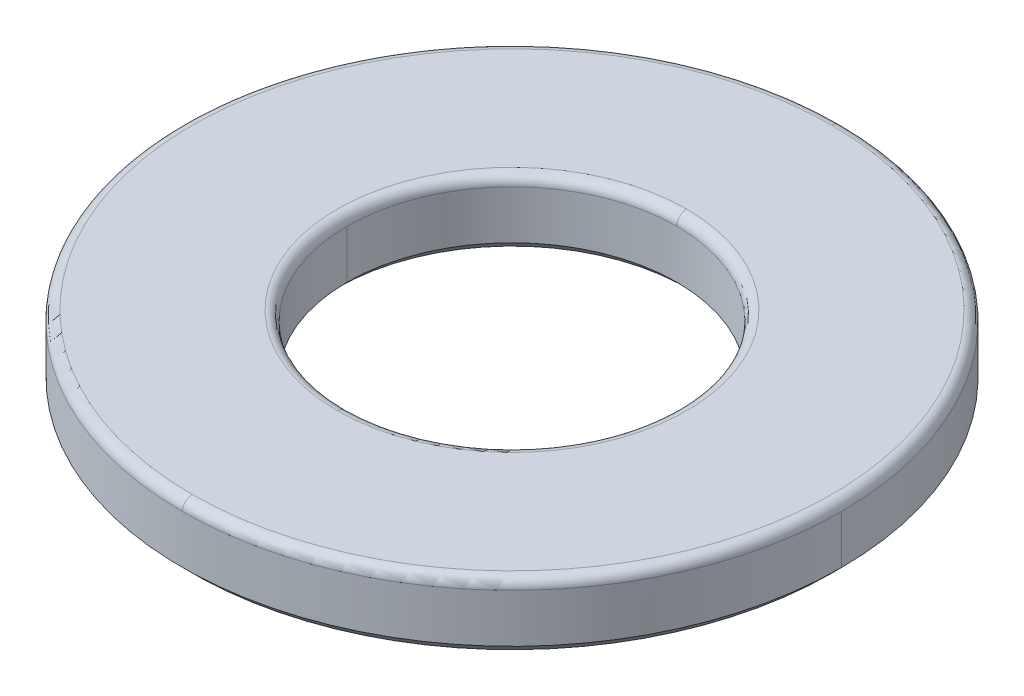
ISO-10303-21;
HEADER;
FILE_DESCRIPTION(('STEP AP214'),'2;1');
FILE_NAME('part.step','',(''),(''),'','','');
FILE_SCHEMA(('AUTOMOTIVE_DESIGN { 1 0 10303 214 1 1 1 1 }'));
ENDSEC;
DATA;
#1=APPLICATION_CONTEXT('core data for automotive mechanical design processes');
#2=APPLICATION_PROTOCOL_DEFINITION('international standard','automotive_design',2000,#1);
#3=PRODUCT_CONTEXT('',#1,'mechanical');
#4=PRODUCT('Part','Part','',(#3));
#5=PRODUCT_RELATED_PRODUCT_CATEGORY('part','',(#4));
#6=PRODUCT_DEFINITION_FORMATION('','',#4);
#7=PRODUCT_DEFINITION_CONTEXT('part definition',#1,'design');
#8=PRODUCT_DEFINITION('design','',#6,#7);
#9=PRODUCT_DEFINITION_SHAPE('','',#8);
#10=(LENGTH_UNIT() NAMED_UNIT(*) SI_UNIT(.MILLI.,.METRE.));
#11=(NAMED_UNIT(*) PLANE_ANGLE_UNIT() SI_UNIT($,.RADIAN.));
#12=(NAMED_UNIT(*) SI_UNIT($,.STERADIAN.) SOLID_ANGLE_UNIT());
#13=UNCERTAINTY_MEASURE_WITH_UNIT(LENGTH_MEASURE(1.E-05),#10,'distance_accuracy_value','');
#14=(GEOMETRIC_REPRESENTATION_CONTEXT(3) GLOBAL_UNCERTAINTY_ASSIGNED_CONTEXT((#13)) GLOBAL_UNIT_ASSIGNED_CONTEXT((#10,
#11,#12)) REPRESENTATION_CONTEXT('',''));
#15=CARTESIAN_POINT('',(0.,0.,0.));
#16=DIRECTION('',(0.,0.,1.));
#17=DIRECTION('',(1.,0.,0.));
#18=AXIS2_PLACEMENT_3D('',#15,#16,#17);
#19=CARTESIAN_POINT('',(0.,13.4,0.));
#20=DIRECTION('',(0.,-1.,0.));
#21=DIRECTION('',(0.,0.,-1.));
#22=AXIS2_PLACEMENT_3D('',#19,#20,#21);
#23=TOROIDAL_SURFACE('',#22,19.4,0.6);
#24=CARTESIAN_POINT('',(0.,13.4,19.4));
#25=DIRECTION('',(1.,0.,0.));
#26=DIRECTION('',(0.,0.,-1.));
#27=AXIS2_PLACEMENT_3D('',#24,#25,#26);
#28=CIRCLE('',#27,0.6);
#29=CARTESIAN_POINT('',(0.,14.,19.4));
#30=VERTEX_POINT('',#29);
#31=CARTESIAN_POINT('',(0.,13.4,20.));
#32=VERTEX_POINT('',#31);
#33=EDGE_CURVE('E151',#30,#32,#28,.T.);
#34=ORIENTED_EDGE('',*,*,#33,.F.);
#35=CARTESIAN_POINT('',(0.,14.,0.));
#36=DIRECTION('',(0.,-1.,0.));
#37=DIRECTION('',(1.,0.,0.));
#38=AXIS2_PLACEMENT_3D('',#35,#36,#37);
#39=CIRCLE('',#38,19.4);
#40=CARTESIAN_POINT('',(0.,14.,-19.4));
#41=VERTEX_POINT('',#40);
#42=EDGE_CURVE('E153',#30,#41,#39,.T.);
#43=ORIENTED_EDGE('',*,*,#42,.T.);
#44=CARTESIAN_POINT('',(0.,13.4,-19.4));
#45=DIRECTION('',(-1.,0.,0.));
#46=DIRECTION('',(0.,0.,1.));
#47=AXIS2_PLACEMENT_3D('',#44,#45,#46);
#48=CIRCLE('',#47,0.6);
#49=CARTESIAN_POINT('',(0.,13.4,-20.));
#50=VERTEX_POINT('',#49);
#51=EDGE_CURVE('E162',#41,#50,#48,.T.);
#52=ORIENTED_EDGE('',*,*,#51,.T.);
#53=CARTESIAN_POINT('',(0.,13.4,0.));
#54=DIRECTION('',(0.,-1.,0.));
#55=DIRECTION('',(1.,0.,0.));
#56=AXIS2_PLACEMENT_3D('',#53,#54,#55);
#57=CIRCLE('',#56,20.);
#58=CARTESIAN_POINT('',(-20.,13.4,0.));
#59=VERTEX_POINT('',#58);
#60=EDGE_CURVE('E185',#59,#50,#57,.T.);
#61=ORIENTED_EDGE('',*,*,#60,.F.);
#62=CARTESIAN_POINT('',(0.,13.4,0.));
#63=DIRECTION('',(0.,-1.,0.));
#64=DIRECTION('',(1.,0.,0.));
#65=AXIS2_PLACEMENT_3D('',#62,#63,#64);
#66=CIRCLE('',#65,20.);
#67=EDGE_CURVE('E11',#32,#59,#66,.T.);
#68=ORIENTED_EDGE('',*,*,#67,.F.);
#69=EDGE_LOOP('',(#34,#43,#52,#61,#68));
#70=FACE_BOUND('',#69,.T.);
#71=ADVANCED_FACE('F17',(#70),#23,.T.);
#72=CARTESIAN_POINT('',(0.,11.9288,0.));
#73=DIRECTION('',(0.,1.,0.));
#74=DIRECTION('',(1.,0.,0.));
#75=AXIS2_PLACEMENT_3D('',#72,#73,#74);
#76=CYLINDRICAL_SURFACE('',#75,20.);
#77=DIRECTION('',(0.,1.,0.));
#78=VECTOR('',#77,1.);
#79=CARTESIAN_POINT('',(-20.,11.9288,0.));
#80=LINE('',#79,#78);
#81=CARTESIAN_POINT('',(-20.,10.4576,0.));
#82=VERTEX_POINT('',#81);
#83=EDGE_CURVE('E161',#82,#59,#80,.T.);
#84=ORIENTED_EDGE('',*,*,#83,.F.);
#85=CARTESIAN_POINT('',(0.,10.4576,0.));
#86=DIRECTION('',(0.,-1.,0.));
#87=DIRECTION('',(1.,0.,0.));
#88=AXIS2_PLACEMENT_3D('',#85,#86,#87);
#89=CIRCLE('',#88,20.);
#90=CARTESIAN_POINT('',(20.,10.4576,0.));
#91=VERTEX_POINT('',#90);
#92=EDGE_CURVE('E28',#91,#82,#89,.T.);
#93=ORIENTED_EDGE('',*,*,#92,.F.);
#94=DIRECTION('',(0.,1.,0.));
#95=VECTOR('',#94,1.);
#96=CARTESIAN_POINT('',(20.,11.9288,0.));
#97=LINE('',#96,#95);
#98=CARTESIAN_POINT('',(20.,13.4,0.));
#99=VERTEX_POINT('',#98);
#100=EDGE_CURVE('E187',#91,#99,#97,.T.);
#101=ORIENTED_EDGE('',*,*,#100,.T.);
#102=CARTESIAN_POINT('',(0.,13.4,0.));
#103=DIRECTION('',(0.,-1.,0.));
#104=DIRECTION('',(1.,0.,0.));
#105=AXIS2_PLACEMENT_3D('',#102,#103,#104);
#106=CIRCLE('',#105,20.);
#107=EDGE_CURVE('E172',#99,#32,#106,.T.);
#108=ORIENTED_EDGE('',*,*,#107,.T.);
#109=ORIENTED_EDGE('',*,*,#67,.T.);
#110=EDGE_LOOP('',(#84,#93,#101,#108,#109));
#111=FACE_BOUND('',#110,.T.);
#112=ADVANCED_FACE('F478',(#111),#76,.T.);
#113=CARTESIAN_POINT('',(0.,10.1576,0.));
#114=DIRECTION('',(0.,1.,0.));
#115=DIRECTION('',(1.,0.,0.));
#116=AXIS2_PLACEMENT_3D('',#113,#114,#115);
#117=CONICAL_SURFACE('',#116,19.7,0.785398163397446);
#118=DIRECTION('',(-0.707106781186546,0.707106781186549,0.));
#119=VECTOR('',#118,1.);
#120=CARTESIAN_POINT('',(-19.7,10.1576,0.));
#121=LINE('',#120,#119);
#122=CARTESIAN_POINT('',(-19.4,9.8576,0.));
#123=VERTEX_POINT('',#122);
#124=EDGE_CURVE('E193',#123,#82,#121,.T.);
#125=ORIENTED_EDGE('',*,*,#124,.F.);
#126=CARTESIAN_POINT('',(0.,9.8576,0.));
#127=DIRECTION('',(0.,-1.,0.));
#128=DIRECTION('',(1.,0.,0.));
#129=AXIS2_PLACEMENT_3D('',#126,#127,#128);
#130=CIRCLE('',#129,19.4);
#131=CARTESIAN_POINT('',(19.4,9.8576,0.));
#132=VERTEX_POINT('',#131);
#133=EDGE_CURVE('E129',#132,#123,#130,.T.);
#134=ORIENTED_EDGE('',*,*,#133,.F.);
#135=DIRECTION('',(0.707106781186546,0.707106781186549,0.));
#136=VECTOR('',#135,1.);
#137=CARTESIAN_POINT('',(19.7,10.1576,0.));
#138=LINE('',#137,#136);
#139=EDGE_CURVE('E147',#132,#91,#138,.T.);
#140=ORIENTED_EDGE('',*,*,#139,.T.);
#141=ORIENTED_EDGE('',*,*,#92,.T.);
#142=EDGE_LOOP('',(#125,#134,#140,#141));
#143=FACE_BOUND('',#142,.T.);
#144=ADVANCED_FACE('F474',(#143),#117,.T.);
#145=CARTESIAN_POINT('',(18.2716,9.8576,0.));
#146=DIRECTION('',(0.,-1.,0.));
#147=DIRECTION('',(-1.,0.,0.));
#148=AXIS2_PLACEMENT_3D('',#145,#146,#147);
#149=PLANE('',#148);
#150=CARTESIAN_POINT('',(0.,9.8576,0.));
#151=DIRECTION('',(0.,-1.,0.));
#152=DIRECTION('',(1.,0.,0.));
#153=AXIS2_PLACEMENT_3D('',#150,#151,#152);
#154=CIRCLE('',#153,17.1432);
#155=CARTESIAN_POINT('',(0.,9.8576,-17.1432));
#156=VERTEX_POINT('',#155);
#157=CARTESIAN_POINT('',(0.,9.8576,17.1432));
#158=VERTEX_POINT('',#157);
#159=EDGE_CURVE('E119',#156,#158,#154,.T.);
#160=ORIENTED_EDGE('',*,*,#159,.F.);
#161=CARTESIAN_POINT('',(0.,9.8576,0.));
#162=DIRECTION('',(0.,-1.,0.));
#163=DIRECTION('',(1.,0.,0.));
#164=AXIS2_PLACEMENT_3D('',#161,#162,#163);
#165=CIRCLE('',#164,17.1432);
#166=EDGE_CURVE('E132',#158,#156,#165,.T.);
#167=ORIENTED_EDGE('',*,*,#166,.F.);
#168=EDGE_LOOP('',(#160,#167));
#169=FACE_BOUND('',#168,.T.);
#170=ORIENTED_EDGE('',*,*,#133,.T.);
#171=CARTESIAN_POINT('',(0.,9.8576,0.));
#172=DIRECTION('',(0.,-1.,0.));
#173=DIRECTION('',(1.,0.,0.));
#174=AXIS2_PLACEMENT_3D('',#171,#172,#173);
#175=CIRCLE('',#174,19.4);
#176=EDGE_CURVE('E190',#123,#132,#175,.T.);
#177=ORIENTED_EDGE('',*,*,#176,.T.);
#178=EDGE_LOOP('',(#170,#177));
#179=FACE_BOUND('',#178,.T.);
#180=ADVANCED_FACE('F133',(#169,#179),#149,.T.);
#181=CARTESIAN_POINT('',(0.,7.,0.));
#182=DIRECTION('',(0.,-1.,0.));
#183=DIRECTION('',(0.,0.,-1.));
#184=AXIS2_PLACEMENT_3D('',#181,#182,#183);
#185=TOROIDAL_SURFACE('',#184,15.,3.572);
#186=CARTESIAN_POINT('',(0.,7.,15.));
#187=DIRECTION('',(1.,0.,0.));
#188=DIRECTION('',(0.,0.,-1.));
#189=AXIS2_PLACEMENT_3D('',#186,#187,#188);
#190=CIRCLE('',#189,3.572);
#191=CARTESIAN_POINT('',(0.,9.8576,12.8568));
#192=VERTEX_POINT('',#191);
#193=EDGE_CURVE('E122',#192,#158,#190,.T.);
#194=ORIENTED_EDGE('',*,*,#193,.F.);
#195=CARTESIAN_POINT('',(0.,9.8576,0.));
#196=DIRECTION('',(0.,-1.,0.));
#197=DIRECTION('',(1.,0.,0.));
#198=AXIS2_PLACEMENT_3D('',#195,#196,#197);
#199=CIRCLE('',#198,12.8568);
#200=CARTESIAN_POINT('',(0.,9.8576,-12.8568));
#201=VERTEX_POINT('',#200);
#202=EDGE_CURVE('E130',#201,#192,#199,.T.);
#203=ORIENTED_EDGE('',*,*,#202,.F.);
#204=CARTESIAN_POINT('',(0.,7.,-15.));
#205=DIRECTION('',(-1.,0.,0.));
#206=DIRECTION('',(0.,0.,1.));
#207=AXIS2_PLACEMENT_3D('',#204,#205,#206);
#208=CIRCLE('',#207,3.572);
#209=EDGE_CURVE('E125',#201,#156,#208,.T.);
#210=ORIENTED_EDGE('',*,*,#209,.T.);
#211=ORIENTED_EDGE('',*,*,#159,.T.);
#212=EDGE_LOOP('',(#194,#203,#210,#211));
#213=FACE_BOUND('',#212,.T.);
#214=ADVANCED_FACE('F19',(#213),#185,.F.);
#215=CARTESIAN_POINT('',(11.7284,9.8576,0.));
#216=DIRECTION('',(0.,-1.,0.));
#217=DIRECTION('',(-1.,0.,0.));
#218=AXIS2_PLACEMENT_3D('',#215,#216,#217);
#219=PLANE('',#218);
#220=CARTESIAN_POINT('',(0.,9.8576,0.));
#221=DIRECTION('',(0.,-1.,0.));
#222=DIRECTION('',(1.,0.,0.));
#223=AXIS2_PLACEMENT_3D('',#220,#221,#222);
#224=CIRCLE('',#223,10.6);
#225=CARTESIAN_POINT('',(10.6,9.8576,0.));
#226=VERTEX_POINT('',#225);
#227=CARTESIAN_POINT('',(-10.6,9.8576,0.));
#228=VERTEX_POINT('',#227);
#229=EDGE_CURVE('E229',#226,#228,#224,.T.);
#230=ORIENTED_EDGE('',*,*,#229,.F.);
#231=CARTESIAN_POINT('',(0.,9.8576,0.));
#232=DIRECTION('',(0.,-1.,0.));
#233=DIRECTION('',(1.,0.,0.));
#234=AXIS2_PLACEMENT_3D('',#231,#232,#233);
#235=CIRCLE('',#234,10.6);
#236=EDGE_CURVE('E171',#228,#226,#235,.T.);
#237=ORIENTED_EDGE('',*,*,#236,.F.);
#238=EDGE_LOOP('',(#230,#237));
#239=FACE_BOUND('',#238,.T.);
#240=ORIENTED_EDGE('',*,*,#202,.T.);
#241=CARTESIAN_POINT('',(0.,9.8576,0.));
#242=DIRECTION('',(0.,-1.,0.));
#243=DIRECTION('',(1.,0.,0.));
#244=AXIS2_PLACEMENT_3D('',#241,#242,#243);
#245=CIRCLE('',#244,12.8568);
#246=EDGE_CURVE('E140',#192,#201,#245,.T.);
#247=ORIENTED_EDGE('',*,*,#246,.T.);
#248=EDGE_LOOP('',(#240,#247));
#249=FACE_BOUND('',#248,.T.);
#250=ADVANCED_FACE('F532',(#239,#249),#219,.T.);
#251=CARTESIAN_POINT('',(0.,10.1576,0.));
#252=DIRECTION('',(0.,-1.,0.));
#253=DIRECTION('',(1.,0.,0.));
#254=AXIS2_PLACEMENT_3D('',#251,#252,#253);
#255=CONICAL_SURFACE('',#254,10.3,0.78539816339745);
#256=DIRECTION('',(-0.707106781186549,-0.707106781186546,0.));
#257=VECTOR('',#256,1.);
#258=CARTESIAN_POINT('',(-10.3,10.1576,0.));
#259=LINE('',#258,#257);
#260=CARTESIAN_POINT('',(-10.,10.4576,0.));
#261=VERTEX_POINT('',#260);
#262=EDGE_CURVE('E249',#261,#228,#259,.T.);
#263=ORIENTED_EDGE('',*,*,#262,.F.);
#264=CARTESIAN_POINT('',(0.,10.4576,0.));
#265=DIRECTION('',(0.,-1.,0.));
#266=DIRECTION('',(1.,0.,0.));
#267=AXIS2_PLACEMENT_3D('',#264,#265,#266);
#268=CIRCLE('',#267,10.);
#269=CARTESIAN_POINT('',(10.,10.4576,0.));
#270=VERTEX_POINT('',#269);
#271=EDGE_CURVE('E170',#270,#261,#268,.T.);
#272=ORIENTED_EDGE('',*,*,#271,.F.);
#273=DIRECTION('',(0.707106781186549,-0.707106781186546,0.));
#274=VECTOR('',#273,1.);
#275=CARTESIAN_POINT('',(10.3,10.1576,0.));
#276=LINE('',#275,#274);
#277=EDGE_CURVE('E166',#270,#226,#276,.T.);
#278=ORIENTED_EDGE('',*,*,#277,.T.);
#279=ORIENTED_EDGE('',*,*,#229,.T.);
#280=EDGE_LOOP('',(#263,#272,#278,#279));
#281=FACE_BOUND('',#280,.T.);
#282=ADVANCED_FACE('F536',(#281),#255,.F.);
#283=CARTESIAN_POINT('',(0.,11.9288,0.));
#284=DIRECTION('',(0.,1.,0.));
#285=DIRECTION('',(1.,0.,0.));
#286=AXIS2_PLACEMENT_3D('',#283,#284,#285);
#287=CYLINDRICAL_SURFACE('',#286,10.);
#288=DIRECTION('',(0.,1.,0.));
#289=VECTOR('',#288,1.);
#290=CARTESIAN_POINT('',(-10.,11.9288,0.));
#291=LINE('',#290,#289);
#292=CARTESIAN_POINT('',(-10.,13.4,0.));
#293=VERTEX_POINT('',#292);
#294=EDGE_CURVE('E217',#261,#293,#291,.T.);
#295=ORIENTED_EDGE('',*,*,#294,.F.);
#296=CARTESIAN_POINT('',(0.,10.4576,0.));
#297=DIRECTION('',(0.,-1.,0.));
#298=DIRECTION('',(1.,0.,0.));
#299=AXIS2_PLACEMENT_3D('',#296,#297,#298);
#300=CIRCLE('',#299,10.);
#301=EDGE_CURVE('E21',#261,#270,#300,.T.);
#302=ORIENTED_EDGE('',*,*,#301,.T.);
#303=DIRECTION('',(0.,1.,0.));
#304=VECTOR('',#303,1.);
#305=CARTESIAN_POINT('',(10.,11.9288,0.));
#306=LINE('',#305,#304);
#307=CARTESIAN_POINT('',(10.,13.4,0.));
#308=VERTEX_POINT('',#307);
#309=EDGE_CURVE('E181',#270,#308,#306,.T.);
#310=ORIENTED_EDGE('',*,*,#309,.T.);
#311=CARTESIAN_POINT('',(0.,13.4,0.));
#312=DIRECTION('',(0.,-1.,0.));
#313=DIRECTION('',(1.,0.,0.));
#314=AXIS2_PLACEMENT_3D('',#311,#312,#313);
#315=CIRCLE('',#314,10.);
#316=CARTESIAN_POINT('',(0.,13.4,-10.));
#317=VERTEX_POINT('',#316);
#318=EDGE_CURVE('E210',#317,#308,#315,.T.);
#319=ORIENTED_EDGE('',*,*,#318,.F.);
#320=CARTESIAN_POINT('',(0.,13.4,0.));
#321=DIRECTION('',(0.,-1.,0.));
#322=DIRECTION('',(1.,0.,0.));
#323=AXIS2_PLACEMENT_3D('',#320,#321,#322);
#324=CIRCLE('',#323,10.);
#325=EDGE_CURVE('E227',#293,#317,#324,.T.);
#326=ORIENTED_EDGE('',*,*,#325,.F.);
#327=EDGE_LOOP('',(#295,#302,#310,#319,#326));
#328=FACE_BOUND('',#327,.T.);
#329=ADVANCED_FACE('F275',(#328),#287,.F.);
#330=CARTESIAN_POINT('',(0.,13.4,0.));
#331=DIRECTION('',(0.,-1.,0.));
#332=DIRECTION('',(0.,0.,-1.));
#333=AXIS2_PLACEMENT_3D('',#330,#331,#332);
#334=TOROIDAL_SURFACE('',#333,10.6,0.6);
#335=CARTESIAN_POINT('',(0.,13.4,10.6));
#336=DIRECTION('',(1.,0.,0.));
#337=DIRECTION('',(0.,0.,-1.));
#338=AXIS2_PLACEMENT_3D('',#335,#336,#337);
#339=CIRCLE('',#338,0.6);
#340=CARTESIAN_POINT('',(0.,13.4,10.));
#341=VERTEX_POINT('',#340);
#342=CARTESIAN_POINT('',(0.,14.,10.6));
#343=VERTEX_POINT('',#342);
#344=EDGE_CURVE('E218',#341,#343,#339,.T.);
#345=ORIENTED_EDGE('',*,*,#344,.F.);
#346=CARTESIAN_POINT('',(0.,13.4,0.));
#347=DIRECTION('',(0.,-1.,0.));
#348=DIRECTION('',(1.,0.,0.));
#349=AXIS2_PLACEMENT_3D('',#346,#347,#348);
#350=CIRCLE('',#349,10.);
#351=EDGE_CURVE('E182',#341,#293,#350,.T.);
#352=ORIENTED_EDGE('',*,*,#351,.T.);
#353=ORIENTED_EDGE('',*,*,#325,.T.);
#354=CARTESIAN_POINT('',(0.,13.4,-10.6));
#355=DIRECTION('',(-1.,0.,0.));
#356=DIRECTION('',(0.,0.,1.));
#357=AXIS2_PLACEMENT_3D('',#354,#355,#356);
#358=CIRCLE('',#357,0.6);
#359=CARTESIAN_POINT('',(0.,14.,-10.6));
#360=VERTEX_POINT('',#359);
#361=EDGE_CURVE('E157',#317,#360,#358,.T.);
#362=ORIENTED_EDGE('',*,*,#361,.T.);
#363=CARTESIAN_POINT('',(0.,14.,0.));
#364=DIRECTION('',(0.,-1.,0.));
#365=DIRECTION('',(1.,0.,0.));
#366=AXIS2_PLACEMENT_3D('',#363,#364,#365);
#367=CIRCLE('',#366,10.6);
#368=EDGE_CURVE('E42',#343,#360,#367,.T.);
#369=ORIENTED_EDGE('',*,*,#368,.F.);
#370=EDGE_LOOP('',(#345,#352,#353,#362,#369));
#371=FACE_BOUND('',#370,.T.);
#372=ADVANCED_FACE('F267',(#371),#334,.T.);
#373=CARTESIAN_POINT('',(15.,14.,0.));
#374=DIRECTION('',(0.,1.,0.));
#375=DIRECTION('',(0.,0.,-1.));
#376=AXIS2_PLACEMENT_3D('',#373,#374,#375);
#377=PLANE('',#376);
#378=CARTESIAN_POINT('',(0.,14.,0.));
#379=DIRECTION('',(0.,-1.,0.));
#380=DIRECTION('',(1.,0.,0.));
#381=AXIS2_PLACEMENT_3D('',#378,#379,#380);
#382=CIRCLE('',#381,10.6);
#383=EDGE_CURVE('E222',#360,#343,#382,.T.);
#384=ORIENTED_EDGE('',*,*,#383,.T.);
#385=ORIENTED_EDGE('',*,*,#368,.T.);
#386=EDGE_LOOP('',(#384,#385));
#387=FACE_BOUND('',#386,.T.);
#388=CARTESIAN_POINT('',(0.,14.,0.));
#389=DIRECTION('',(0.,-1.,0.));
#390=DIRECTION('',(1.,0.,0.));
#391=AXIS2_PLACEMENT_3D('',#388,#389,#390);
#392=CIRCLE('',#391,19.4);
#393=EDGE_CURVE('E245',#41,#30,#392,.T.);
#394=ORIENTED_EDGE('',*,*,#393,.F.);
#395=ORIENTED_EDGE('',*,*,#42,.F.);
#396=EDGE_LOOP('',(#394,#395));
#397=FACE_BOUND('',#396,.T.);
#398=ADVANCED_FACE('F466',(#387,#397),#377,.T.);
#399=CARTESIAN_POINT('',(0.,13.4,0.));
#400=DIRECTION('',(0.,-1.,0.));
#401=DIRECTION('',(0.,0.,-1.));
#402=AXIS2_PLACEMENT_3D('',#399,#400,#401);
#403=TOROIDAL_SURFACE('',#402,10.6,0.6);
#404=ORIENTED_EDGE('',*,*,#318,.T.);
#405=CARTESIAN_POINT('',(0.,13.4,0.));
#406=DIRECTION('',(0.,-1.,0.));
#407=DIRECTION('',(1.,0.,0.));
#408=AXIS2_PLACEMENT_3D('',#405,#406,#407);
#409=CIRCLE('',#408,10.);
#410=EDGE_CURVE('E177',#308,#341,#409,.T.);
#411=ORIENTED_EDGE('',*,*,#410,.T.);
#412=ORIENTED_EDGE('',*,*,#344,.T.);
#413=ORIENTED_EDGE('',*,*,#383,.F.);
#414=ORIENTED_EDGE('',*,*,#361,.F.);
#415=EDGE_LOOP('',(#404,#411,#412,#413,#414));
#416=FACE_BOUND('',#415,.T.);
#417=ADVANCED_FACE('F274',(#416),#403,.T.);
#418=CARTESIAN_POINT('',(0.,11.9288,0.));
#419=DIRECTION('',(0.,1.,0.));
#420=DIRECTION('',(1.,0.,0.));
#421=AXIS2_PLACEMENT_3D('',#418,#419,#420);
#422=CYLINDRICAL_SURFACE('',#421,10.);
#423=ORIENTED_EDGE('',*,*,#271,.T.);
#424=ORIENTED_EDGE('',*,*,#294,.T.);
#425=ORIENTED_EDGE('',*,*,#351,.F.);
#426=ORIENTED_EDGE('',*,*,#410,.F.);
#427=ORIENTED_EDGE('',*,*,#309,.F.);
#428=EDGE_LOOP('',(#423,#424,#425,#426,#427));
#429=FACE_BOUND('',#428,.T.);
#430=ADVANCED_FACE('F456',(#429),#422,.F.);
#431=CARTESIAN_POINT('',(0.,10.1576,0.));
#432=DIRECTION('',(0.,-1.,0.));
#433=DIRECTION('',(1.,0.,0.));
#434=AXIS2_PLACEMENT_3D('',#431,#432,#433);
#435=CONICAL_SURFACE('',#434,10.3,0.78539816339745);
#436=ORIENTED_EDGE('',*,*,#301,.F.);
#437=ORIENTED_EDGE('',*,*,#262,.T.);
#438=ORIENTED_EDGE('',*,*,#236,.T.);
#439=ORIENTED_EDGE('',*,*,#277,.F.);
#440=EDGE_LOOP('',(#436,#437,#438,#439));
#441=FACE_BOUND('',#440,.T.);
#442=ADVANCED_FACE('F460',(#441),#435,.F.);
#443=CARTESIAN_POINT('',(0.,7.,0.));
#444=DIRECTION('',(0.,-1.,0.));
#445=DIRECTION('',(0.,0.,-1.));
#446=AXIS2_PLACEMENT_3D('',#443,#444,#445);
#447=TOROIDAL_SURFACE('',#446,15.,3.572);
#448=ORIENTED_EDGE('',*,*,#246,.F.);
#449=ORIENTED_EDGE('',*,*,#193,.T.);
#450=ORIENTED_EDGE('',*,*,#166,.T.);
#451=ORIENTED_EDGE('',*,*,#209,.F.);
#452=EDGE_LOOP('',(#448,#449,#450,#451));
#453=FACE_BOUND('',#452,.T.);
#454=ADVANCED_FACE('F138',(#453),#447,.F.);
#455=CARTESIAN_POINT('',(0.,10.1576,0.));
#456=DIRECTION('',(0.,1.,0.));
#457=DIRECTION('',(1.,0.,0.));
#458=AXIS2_PLACEMENT_3D('',#455,#456,#457);
#459=CONICAL_SURFACE('',#458,19.7,0.785398163397446);
#460=ORIENTED_EDGE('',*,*,#176,.F.);
#461=ORIENTED_EDGE('',*,*,#124,.T.);
#462=CARTESIAN_POINT('',(0.,10.4576,0.));
#463=DIRECTION('',(0.,-1.,0.));
#464=DIRECTION('',(1.,0.,0.));
#465=AXIS2_PLACEMENT_3D('',#462,#463,#464);
#466=CIRCLE('',#465,20.);
#467=EDGE_CURVE('E158',#82,#91,#466,.T.);
#468=ORIENTED_EDGE('',*,*,#467,.T.);
#469=ORIENTED_EDGE('',*,*,#139,.F.);
#470=EDGE_LOOP('',(#460,#461,#468,#469));
#471=FACE_BOUND('',#470,.T.);
#472=ADVANCED_FACE('F516',(#471),#459,.T.);
#473=CARTESIAN_POINT('',(0.,11.9288,0.));
#474=DIRECTION('',(0.,1.,0.));
#475=DIRECTION('',(1.,0.,0.));
#476=AXIS2_PLACEMENT_3D('',#473,#474,#475);
#477=CYLINDRICAL_SURFACE('',#476,20.);
#478=ORIENTED_EDGE('',*,*,#467,.F.);
#479=ORIENTED_EDGE('',*,*,#83,.T.);
#480=ORIENTED_EDGE('',*,*,#60,.T.);
#481=CARTESIAN_POINT('',(0.,13.4,0.));
#482=DIRECTION('',(0.,-1.,0.));
#483=DIRECTION('',(1.,0.,0.));
#484=AXIS2_PLACEMENT_3D('',#481,#482,#483);
#485=CIRCLE('',#484,20.);
#486=EDGE_CURVE('E176',#50,#99,#485,.T.);
#487=ORIENTED_EDGE('',*,*,#486,.T.);
#488=ORIENTED_EDGE('',*,*,#100,.F.);
#489=EDGE_LOOP('',(#478,#479,#480,#487,#488));
#490=FACE_BOUND('',#489,.T.);
#491=ADVANCED_FACE('F488',(#490),#477,.T.);
#492=CARTESIAN_POINT('',(0.,13.4,0.));
#493=DIRECTION('',(0.,-1.,0.));
#494=DIRECTION('',(0.,0.,-1.));
#495=AXIS2_PLACEMENT_3D('',#492,#493,#494);
#496=TOROIDAL_SURFACE('',#495,19.4,0.6);
#497=ORIENTED_EDGE('',*,*,#393,.T.);
#498=ORIENTED_EDGE('',*,*,#33,.T.);
#499=ORIENTED_EDGE('',*,*,#107,.F.);
#500=ORIENTED_EDGE('',*,*,#486,.F.);
#501=ORIENTED_EDGE('',*,*,#51,.F.);
#502=EDGE_LOOP('',(#497,#498,#499,#500,#501));
#503=FACE_BOUND('',#502,.T.);
#504=ADVANCED_FACE('F484',(#503),#496,.T.);
#505=CLOSED_SHELL('',(#71,#112,#144,#180,#214,#250,#282,#329,#372,#398,#417,#430,#442,#454,#472,
#491,#504));
#506=MANIFOLD_SOLID_BREP('B1',#505);
#507=ADVANCED_BREP_SHAPE_REPRESENTATION('',(#18,#506),#14);
#508=SHAPE_DEFINITION_REPRESENTATION(#9,#507);
ENDSEC;
END-ISO-10303-21;
